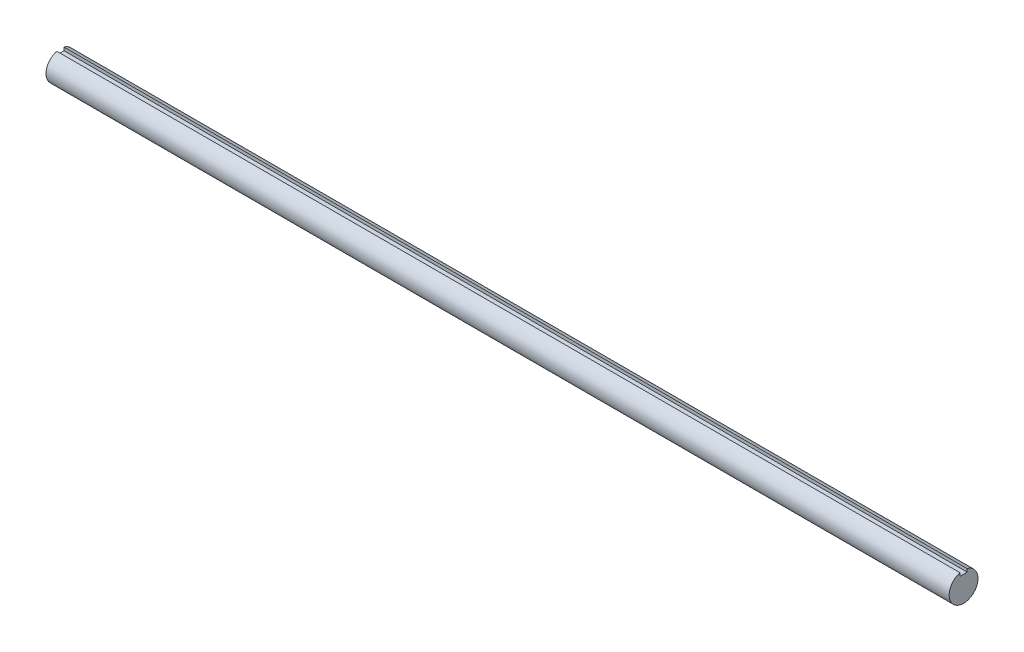
ISO-10303-21;
HEADER;
FILE_DESCRIPTION(('STEP AP214'),'2;1');
FILE_NAME('part.step','',(''),(''),'','','');
FILE_SCHEMA(('AUTOMOTIVE_DESIGN { 1 0 10303 214 1 1 1 1 }'));
ENDSEC;
DATA;
#1=APPLICATION_CONTEXT('core data for automotive mechanical design processes');
#2=APPLICATION_PROTOCOL_DEFINITION('international standard','automotive_design',2000,#1);
#3=PRODUCT_CONTEXT('',#1,'mechanical');
#4=PRODUCT('Part','Part','',(#3));
#5=PRODUCT_RELATED_PRODUCT_CATEGORY('part','',(#4));
#6=PRODUCT_DEFINITION_FORMATION('','',#4);
#7=PRODUCT_DEFINITION_CONTEXT('part definition',#1,'design');
#8=PRODUCT_DEFINITION('design','',#6,#7);
#9=PRODUCT_DEFINITION_SHAPE('','',#8);
#10=(LENGTH_UNIT() NAMED_UNIT(*) SI_UNIT(.MILLI.,.METRE.));
#11=(NAMED_UNIT(*) PLANE_ANGLE_UNIT() SI_UNIT($,.RADIAN.));
#12=(NAMED_UNIT(*) SI_UNIT($,.STERADIAN.) SOLID_ANGLE_UNIT());
#13=UNCERTAINTY_MEASURE_WITH_UNIT(LENGTH_MEASURE(1.E-05),#10,'distance_accuracy_value','');
#14=(GEOMETRIC_REPRESENTATION_CONTEXT(3) GLOBAL_UNCERTAINTY_ASSIGNED_CONTEXT((#13)) GLOBAL_UNIT_ASSIGNED_CONTEXT((#10,
#11,#12)) REPRESENTATION_CONTEXT('',''));
#15=CARTESIAN_POINT('',(0.,0.,0.));
#16=DIRECTION('',(0.,0.,1.));
#17=DIRECTION('',(1.,0.,0.));
#18=AXIS2_PLACEMENT_3D('',#15,#16,#17);
#19=CARTESIAN_POINT('',(298.45,7.14482159315641,2.38125));
#20=DIRECTION('',(0.,-1.,0.));
#21=DIRECTION('',(0.,0.,-1.));
#22=AXIS2_PLACEMENT_3D('',#19,#20,#21);
#23=PLANE('',#22);
#24=DIRECTION('',(1.,0.,0.));
#25=VECTOR('',#24,1.);
#26=CARTESIAN_POINT('',(298.45,7.14482159315641,2.38125));
#27=LINE('',#26,#25);
#28=CARTESIAN_POINT('',(-298.45,7.14482159315641,2.38125));
#29=VERTEX_POINT('',#28);
#30=CARTESIAN_POINT('',(298.45,7.14482159315641,2.38125));
#31=VERTEX_POINT('',#30);
#32=EDGE_CURVE('E61',#29,#31,#27,.T.);
#33=ORIENTED_EDGE('',*,*,#32,.T.);
#34=DIRECTION('',(0.,0.,-1.));
#35=VECTOR('',#34,1.);
#36=CARTESIAN_POINT('',(298.45,7.14482159315641,0.));
#37=LINE('',#36,#35);
#38=CARTESIAN_POINT('',(298.45,7.14482159315641,-2.38125));
#39=VERTEX_POINT('',#38);
#40=EDGE_CURVE('E63',#39,#31,#37,.F.);
#41=ORIENTED_EDGE('',*,*,#40,.F.);
#42=DIRECTION('',(-1.,0.,0.));
#43=VECTOR('',#42,1.);
#44=CARTESIAN_POINT('',(298.45,7.14482159315641,-2.38125));
#45=LINE('',#44,#43);
#46=CARTESIAN_POINT('',(-298.45,7.14482159315641,-2.38125));
#47=VERTEX_POINT('',#46);
#48=EDGE_CURVE('E54',#39,#47,#45,.T.);
#49=ORIENTED_EDGE('',*,*,#48,.T.);
#50=DIRECTION('',(0.,0.,-1.));
#51=VECTOR('',#50,1.);
#52=CARTESIAN_POINT('',(-298.45,7.14482159315641,0.));
#53=LINE('',#52,#51);
#54=EDGE_CURVE('E64',#47,#29,#53,.F.);
#55=ORIENTED_EDGE('',*,*,#54,.T.);
#56=EDGE_LOOP('',(#33,#41,#49,#55));
#57=FACE_BOUND('',#56,.T.);
#58=ADVANCED_FACE('F16',(#57),#23,.F.);
#59=CARTESIAN_POINT('',(298.45,0.,0.));
#60=DIRECTION('',(1.,0.,0.));
#61=DIRECTION('',(0.,0.,-1.));
#62=AXIS2_PLACEMENT_3D('',#59,#60,#61);
#63=PLANE('',#62);
#64=DIRECTION('',(0.,1.,0.));
#65=VECTOR('',#64,1.);
#66=CARTESIAN_POINT('',(298.45,9.22254159315641,2.38125));
#67=LINE('',#66,#65);
#68=CARTESIAN_POINT('',(298.45,9.22254159315641,2.38125));
#69=VERTEX_POINT('',#68);
#70=EDGE_CURVE('E68',#31,#69,#67,.T.);
#71=ORIENTED_EDGE('',*,*,#70,.T.);
#72=CARTESIAN_POINT('',(298.45,0.,0.));
#73=DIRECTION('',(-1.,0.,0.));
#74=DIRECTION('',(0.,0.,1.));
#75=AXIS2_PLACEMENT_3D('',#72,#73,#74);
#76=CIRCLE('',#75,9.525);
#77=CARTESIAN_POINT('',(298.45,9.22254159315641,-2.38125));
#78=VERTEX_POINT('',#77);
#79=EDGE_CURVE('E19',#78,#69,#76,.T.);
#80=ORIENTED_EDGE('',*,*,#79,.F.);
#81=DIRECTION('',(0.,1.,0.));
#82=VECTOR('',#81,1.);
#83=CARTESIAN_POINT('',(298.45,9.22254159315641,-2.38125));
#84=LINE('',#83,#82);
#85=EDGE_CURVE('E72',#78,#39,#84,.F.);
#86=ORIENTED_EDGE('',*,*,#85,.T.);
#87=ORIENTED_EDGE('',*,*,#40,.T.);
#88=EDGE_LOOP('',(#71,#80,#86,#87));
#89=FACE_BOUND('',#88,.T.);
#90=ADVANCED_FACE('F70',(#89),#63,.T.);
#91=CARTESIAN_POINT('',(298.45,9.22254159315641,2.38125));
#92=DIRECTION('',(0.,0.,1.));
#93=DIRECTION('',(1.,0.,0.));
#94=AXIS2_PLACEMENT_3D('',#91,#92,#93);
#95=PLANE('',#94);
#96=DIRECTION('',(-1.,0.,0.));
#97=VECTOR('',#96,1.);
#98=CARTESIAN_POINT('',(298.45,9.22254159315641,2.38125));
#99=LINE('',#98,#97);
#100=CARTESIAN_POINT('',(-298.45,9.22254159315641,2.38125));
#101=VERTEX_POINT('',#100);
#102=EDGE_CURVE('E76',#69,#101,#99,.T.);
#103=ORIENTED_EDGE('',*,*,#102,.F.);
#104=ORIENTED_EDGE('',*,*,#70,.F.);
#105=ORIENTED_EDGE('',*,*,#32,.F.);
#106=DIRECTION('',(0.,1.,0.));
#107=VECTOR('',#106,1.);
#108=CARTESIAN_POINT('',(-298.45,0.,2.38125));
#109=LINE('',#108,#107);
#110=EDGE_CURVE('E78',#29,#101,#109,.T.);
#111=ORIENTED_EDGE('',*,*,#110,.T.);
#112=EDGE_LOOP('',(#103,#104,#105,#111));
#113=FACE_BOUND('',#112,.T.);
#114=ADVANCED_FACE('F74',(#113),#95,.F.);
#115=CARTESIAN_POINT('',(-298.45,0.,0.));
#116=DIRECTION('',(1.,0.,0.));
#117=DIRECTION('',(0.,0.,-1.));
#118=AXIS2_PLACEMENT_3D('',#115,#116,#117);
#119=PLANE('',#118);
#120=CARTESIAN_POINT('',(-298.45,0.,0.));
#121=DIRECTION('',(-1.,0.,0.));
#122=DIRECTION('',(0.,0.,1.));
#123=AXIS2_PLACEMENT_3D('',#120,#121,#122);
#124=CIRCLE('',#123,9.525);
#125=CARTESIAN_POINT('',(-298.45,9.22254159315641,-2.38125));
#126=VERTEX_POINT('',#125);
#127=EDGE_CURVE('E25',#101,#126,#124,.F.);
#128=ORIENTED_EDGE('',*,*,#127,.F.);
#129=ORIENTED_EDGE('',*,*,#110,.F.);
#130=ORIENTED_EDGE('',*,*,#54,.F.);
#131=DIRECTION('',(0.,1.,0.));
#132=VECTOR('',#131,1.);
#133=CARTESIAN_POINT('',(-298.45,9.22254159315641,-2.38125));
#134=LINE('',#133,#132);
#135=EDGE_CURVE('E34',#47,#126,#134,.T.);
#136=ORIENTED_EDGE('',*,*,#135,.T.);
#137=EDGE_LOOP('',(#128,#129,#130,#136));
#138=FACE_BOUND('',#137,.T.);
#139=ADVANCED_FACE('F103',(#138),#119,.F.);
#140=CARTESIAN_POINT('',(298.45,9.22254159315641,-2.38125));
#141=DIRECTION('',(0.,0.,-1.));
#142=DIRECTION('',(-1.,0.,0.));
#143=AXIS2_PLACEMENT_3D('',#140,#141,#142);
#144=PLANE('',#143);
#145=ORIENTED_EDGE('',*,*,#48,.F.);
#146=ORIENTED_EDGE('',*,*,#85,.F.);
#147=DIRECTION('',(-1.,0.,0.));
#148=VECTOR('',#147,1.);
#149=CARTESIAN_POINT('',(298.45,9.22254159315641,-2.38125));
#150=LINE('',#149,#148);
#151=EDGE_CURVE('E10',#126,#78,#150,.F.);
#152=ORIENTED_EDGE('',*,*,#151,.F.);
#153=ORIENTED_EDGE('',*,*,#135,.F.);
#154=EDGE_LOOP('',(#145,#146,#152,#153));
#155=FACE_BOUND('',#154,.T.);
#156=ADVANCED_FACE('F105',(#155),#144,.F.);
#157=CARTESIAN_POINT('',(298.45,0.,0.));
#158=DIRECTION('',(-1.,0.,0.));
#159=DIRECTION('',(0.,0.,1.));
#160=AXIS2_PLACEMENT_3D('',#157,#158,#159);
#161=CYLINDRICAL_SURFACE('',#160,9.525);
#162=ORIENTED_EDGE('',*,*,#127,.T.);
#163=ORIENTED_EDGE('',*,*,#151,.T.);
#164=ORIENTED_EDGE('',*,*,#79,.T.);
#165=ORIENTED_EDGE('',*,*,#102,.T.);
#166=EDGE_LOOP('',(#162,#163,#164,#165));
#167=FACE_BOUND('',#166,.T.);
#168=ADVANCED_FACE('F112',(#167),#161,.T.);
#169=CLOSED_SHELL('',(#58,#90,#114,#139,#156,#168));
#170=MANIFOLD_SOLID_BREP('B1',#169);
#171=ADVANCED_BREP_SHAPE_REPRESENTATION('',(#18,#170),#14);
#172=SHAPE_DEFINITION_REPRESENTATION(#9,#171);
ENDSEC;
END-ISO-10303-21;
